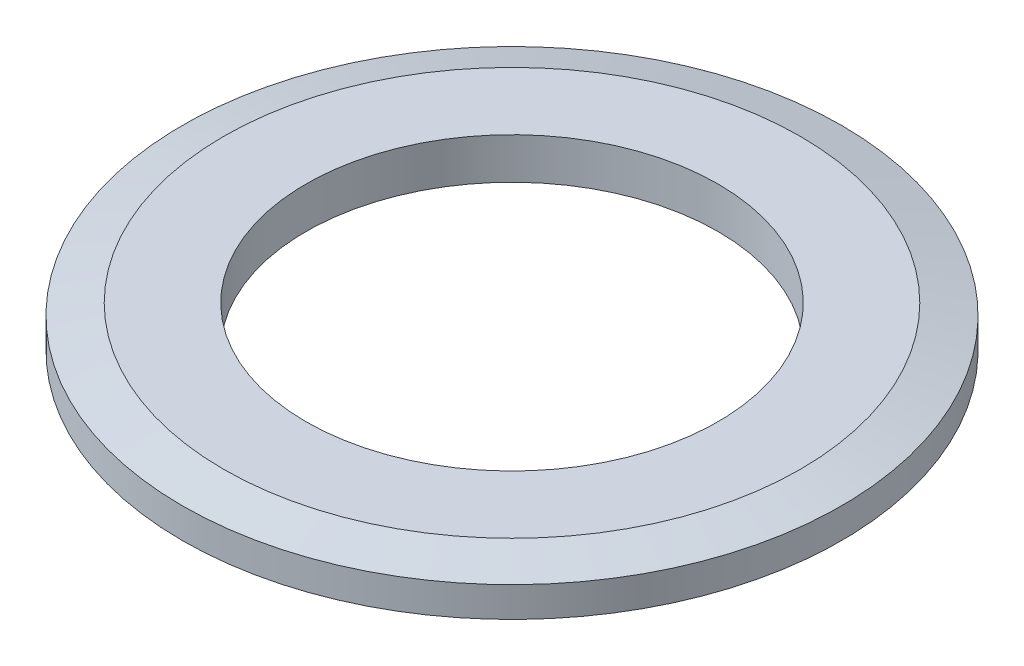
ISO-10303-21;
HEADER;
FILE_DESCRIPTION(('STEP AP214'),'2;1');
FILE_NAME('part.step','',(''),(''),'','','');
FILE_SCHEMA(('AUTOMOTIVE_DESIGN { 1 0 10303 214 1 1 1 1 }'));
ENDSEC;
DATA;
#1=APPLICATION_CONTEXT('core data for automotive mechanical design processes');
#2=APPLICATION_PROTOCOL_DEFINITION('international standard','automotive_design',2000,#1);
#3=PRODUCT_CONTEXT('',#1,'mechanical');
#4=PRODUCT('Part','Part','',(#3));
#5=PRODUCT_RELATED_PRODUCT_CATEGORY('part','',(#4));
#6=PRODUCT_DEFINITION_FORMATION('','',#4);
#7=PRODUCT_DEFINITION_CONTEXT('part definition',#1,'design');
#8=PRODUCT_DEFINITION('design','',#6,#7);
#9=PRODUCT_DEFINITION_SHAPE('','',#8);
#10=(LENGTH_UNIT() NAMED_UNIT(*) SI_UNIT(.MILLI.,.METRE.));
#11=(NAMED_UNIT(*) PLANE_ANGLE_UNIT() SI_UNIT($,.RADIAN.));
#12=(NAMED_UNIT(*) SI_UNIT($,.STERADIAN.) SOLID_ANGLE_UNIT());
#13=UNCERTAINTY_MEASURE_WITH_UNIT(LENGTH_MEASURE(1.E-05),#10,'distance_accuracy_value','');
#14=(GEOMETRIC_REPRESENTATION_CONTEXT(3) GLOBAL_UNCERTAINTY_ASSIGNED_CONTEXT((#13)) GLOBAL_UNIT_ASSIGNED_CONTEXT((#10,
#11,#12)) REPRESENTATION_CONTEXT('',''));
#15=CARTESIAN_POINT('',(0.,0.,0.));
#16=DIRECTION('',(0.,0.,1.));
#17=DIRECTION('',(1.,0.,0.));
#18=AXIS2_PLACEMENT_3D('',#15,#16,#17);
#19=CARTESIAN_POINT('',(0.,1.,0.));
#20=DIRECTION('',(0.,1.,0.));
#21=DIRECTION('',(0.,0.,1.));
#22=AXIS2_PLACEMENT_3D('',#19,#20,#21);
#23=PLANE('',#22);
#24=CARTESIAN_POINT('',(0.,1.,0.));
#25=DIRECTION('',(0.,1.,0.));
#26=DIRECTION('',(0.,0.,1.));
#27=AXIS2_PLACEMENT_3D('',#24,#25,#26);
#28=CIRCLE('',#27,6.99999999999999);
#29=CARTESIAN_POINT('',(0.,1.,6.99999999999999));
#30=VERTEX_POINT('',#29);
#31=EDGE_CURVE('E39',#30,#30,#28,.T.);
#32=ORIENTED_EDGE('',*,*,#31,.T.);
#33=EDGE_LOOP('',(#32));
#34=FACE_BOUND('',#33,.T.);
#35=CARTESIAN_POINT('',(0.,1.,0.));
#36=DIRECTION('',(0.,1.,0.));
#37=DIRECTION('',(0.,0.,1.));
#38=AXIS2_PLACEMENT_3D('',#35,#36,#37);
#39=CIRCLE('',#38,5.);
#40=CARTESIAN_POINT('',(0.,1.,5.));
#41=VERTEX_POINT('',#40);
#42=EDGE_CURVE('E47',#41,#41,#39,.T.);
#43=ORIENTED_EDGE('',*,*,#42,.F.);
#44=EDGE_LOOP('',(#43));
#45=FACE_BOUND('',#44,.T.);
#46=ADVANCED_FACE('F32',(#34,#45),#23,.T.);
#47=CARTESIAN_POINT('',(0.,0.,0.));
#48=DIRECTION('',(0.,1.,0.));
#49=DIRECTION('',(0.,0.,1.));
#50=AXIS2_PLACEMENT_3D('',#47,#48,#49);
#51=PLANE('',#50);
#52=CARTESIAN_POINT('',(0.,0.,0.));
#53=DIRECTION('',(0.,1.,0.));
#54=DIRECTION('',(0.,0.,1.));
#55=AXIS2_PLACEMENT_3D('',#52,#53,#54);
#56=CIRCLE('',#55,8.);
#57=CARTESIAN_POINT('',(0.,0.,8.));
#58=VERTEX_POINT('',#57);
#59=EDGE_CURVE('E43',#58,#58,#56,.T.);
#60=ORIENTED_EDGE('',*,*,#59,.F.);
#61=EDGE_LOOP('',(#60));
#62=FACE_BOUND('',#61,.T.);
#63=CARTESIAN_POINT('',(0.,0.,0.));
#64=DIRECTION('',(0.,1.,0.));
#65=DIRECTION('',(0.,0.,1.));
#66=AXIS2_PLACEMENT_3D('',#63,#64,#65);
#67=CIRCLE('',#66,5.);
#68=CARTESIAN_POINT('',(0.,0.,5.));
#69=VERTEX_POINT('',#68);
#70=EDGE_CURVE('E50',#69,#69,#67,.T.);
#71=ORIENTED_EDGE('',*,*,#70,.T.);
#72=EDGE_LOOP('',(#71));
#73=FACE_BOUND('',#72,.T.);
#74=ADVANCED_FACE('F60',(#62,#73),#51,.F.);
#75=CARTESIAN_POINT('',(0.,1.,0.));
#76=DIRECTION('',(0.,-1.,0.));
#77=DIRECTION('',(0.,0.,-1.));
#78=AXIS2_PLACEMENT_3D('',#75,#76,#77);
#79=CYLINDRICAL_SURFACE('',#78,8.);
#80=CARTESIAN_POINT('',(0.,0.732050807568877,0.));
#81=DIRECTION('',(0.,1.,0.));
#82=DIRECTION('',(0.,0.,1.));
#83=AXIS2_PLACEMENT_3D('',#80,#81,#82);
#84=CIRCLE('',#83,8.);
#85=CARTESIAN_POINT('',(0.,0.732050807568877,8.));
#86=VERTEX_POINT('',#85);
#87=EDGE_CURVE('E10',#86,#86,#84,.F.);
#88=ORIENTED_EDGE('',*,*,#87,.T.);
#89=EDGE_LOOP('',(#88));
#90=FACE_BOUND('',#89,.T.);
#91=ORIENTED_EDGE('',*,*,#59,.T.);
#92=EDGE_LOOP('',(#91));
#93=FACE_BOUND('',#92,.T.);
#94=ADVANCED_FACE('F65',(#90,#93),#79,.T.);
#95=CARTESIAN_POINT('',(0.,1.,0.));
#96=DIRECTION('',(0.,-1.,0.));
#97=DIRECTION('',(0.,0.,-1.));
#98=AXIS2_PLACEMENT_3D('',#95,#96,#97);
#99=CYLINDRICAL_SURFACE('',#98,5.);
#100=ORIENTED_EDGE('',*,*,#42,.T.);
#101=EDGE_LOOP('',(#100));
#102=FACE_BOUND('',#101,.T.);
#103=ORIENTED_EDGE('',*,*,#70,.F.);
#104=EDGE_LOOP('',(#103));
#105=FACE_BOUND('',#104,.T.);
#106=ADVANCED_FACE('F56',(#102,#105),#99,.F.);
#107=CARTESIAN_POINT('',(0.,1.,0.));
#108=DIRECTION('',(0.,-1.,0.));
#109=DIRECTION('',(0.,0.,-1.));
#110=AXIS2_PLACEMENT_3D('',#107,#108,#109);
#111=CONICAL_SURFACE('',#110,6.99999999999999,1.30899693899575);
#112=ORIENTED_EDGE('',*,*,#87,.F.);
#113=EDGE_LOOP('',(#112));
#114=FACE_BOUND('',#113,.T.);
#115=ORIENTED_EDGE('',*,*,#31,.F.);
#116=EDGE_LOOP('',(#115));
#117=FACE_BOUND('',#116,.T.);
#118=ADVANCED_FACE('F34',(#114,#117),#111,.T.);
#119=CLOSED_SHELL('',(#46,#74,#94,#106,#118));
#120=MANIFOLD_SOLID_BREP('B2',#119);
#121=ADVANCED_BREP_SHAPE_REPRESENTATION('',(#18,#120),#14);
#122=SHAPE_DEFINITION_REPRESENTATION(#9,#121);
ENDSEC;
END-ISO-10303-21;
